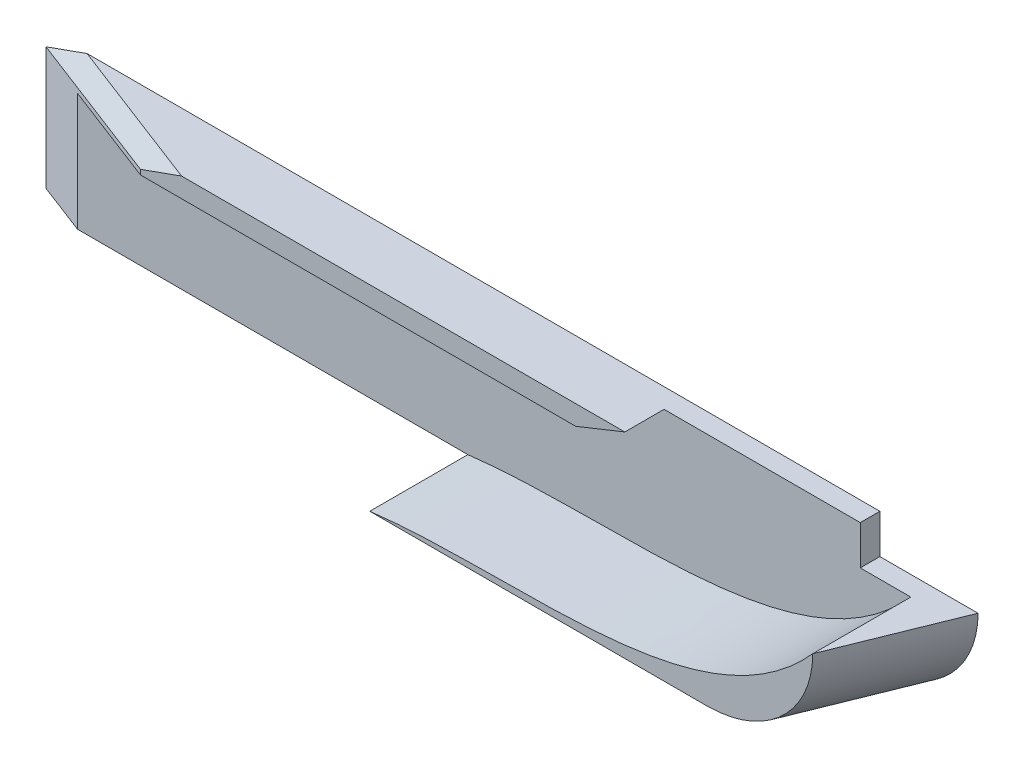
ISO-10303-21;
HEADER;
FILE_DESCRIPTION(('STEP AP214'),'2;1');
FILE_NAME('part.step','',(''),(''),'','','');
FILE_SCHEMA(('AUTOMOTIVE_DESIGN { 1 0 10303 214 1 1 1 1 }'));
ENDSEC;
DATA;
#1=APPLICATION_CONTEXT('core data for automotive mechanical design processes');
#2=APPLICATION_PROTOCOL_DEFINITION('international standard','automotive_design',2000,#1);
#3=PRODUCT_CONTEXT('',#1,'mechanical');
#4=PRODUCT('Part','Part','',(#3));
#5=PRODUCT_RELATED_PRODUCT_CATEGORY('part','',(#4));
#6=PRODUCT_DEFINITION_FORMATION('','',#4);
#7=PRODUCT_DEFINITION_CONTEXT('part definition',#1,'design');
#8=PRODUCT_DEFINITION('design','',#6,#7);
#9=PRODUCT_DEFINITION_SHAPE('','',#8);
#10=(LENGTH_UNIT() NAMED_UNIT(*) SI_UNIT(.MILLI.,.METRE.));
#11=(NAMED_UNIT(*) PLANE_ANGLE_UNIT() SI_UNIT($,.RADIAN.));
#12=(NAMED_UNIT(*) SI_UNIT($,.STERADIAN.) SOLID_ANGLE_UNIT());
#13=UNCERTAINTY_MEASURE_WITH_UNIT(LENGTH_MEASURE(1.E-05),#10,'distance_accuracy_value','');
#14=(GEOMETRIC_REPRESENTATION_CONTEXT(3) GLOBAL_UNCERTAINTY_ASSIGNED_CONTEXT((#13)) GLOBAL_UNIT_ASSIGNED_CONTEXT((#10,
#11,#12)) REPRESENTATION_CONTEXT('',''));
#15=CARTESIAN_POINT('',(0.,0.,0.));
#16=DIRECTION('',(0.,0.,1.));
#17=DIRECTION('',(1.,0.,0.));
#18=AXIS2_PLACEMENT_3D('',#15,#16,#17);
#19=CARTESIAN_POINT('',(32.9411764705883,11.906862745098,2.));
#20=DIRECTION('',(-1.,0.,0.));
#21=DIRECTION('',(0.,0.,1.));
#22=AXIS2_PLACEMENT_3D('',#19,#20,#21);
#23=PLANE('',#22);
#24=DIRECTION('',(0.,0.,-1.));
#25=VECTOR('',#24,1.);
#26=CARTESIAN_POINT('',(32.9411764705883,11.906862745098,2.));
#27=LINE('',#26,#25);
#28=CARTESIAN_POINT('',(32.9411764705883,11.906862745098,2.));
#29=VERTEX_POINT('',#28);
#30=CARTESIAN_POINT('',(32.9411764705883,11.906862745098,0.));
#31=VERTEX_POINT('',#30);
#32=EDGE_CURVE('E206',#29,#31,#27,.T.);
#33=ORIENTED_EDGE('',*,*,#32,.F.);
#34=DIRECTION('',(0.,1.,0.));
#35=VECTOR('',#34,1.);
#36=CARTESIAN_POINT('',(32.9411764705883,11.906862745098,2.));
#37=LINE('',#36,#35);
#38=CARTESIAN_POINT('',(32.9411764705883,7.90686274509804,2.));
#39=VERTEX_POINT('',#38);
#40=EDGE_CURVE('E203',#39,#29,#37,.T.);
#41=ORIENTED_EDGE('',*,*,#40,.F.);
#42=DIRECTION('',(0.,0.,-1.));
#43=VECTOR('',#42,1.);
#44=CARTESIAN_POINT('',(32.9411764705883,7.90686274509804,2.));
#45=LINE('',#44,#43);
#46=CARTESIAN_POINT('',(32.9411764705883,7.90686274509804,0.));
#47=VERTEX_POINT('',#46);
#48=EDGE_CURVE('E150',#39,#47,#45,.T.);
#49=ORIENTED_EDGE('',*,*,#48,.T.);
#50=DIRECTION('',(0.,1.,0.));
#51=VECTOR('',#50,1.);
#52=CARTESIAN_POINT('',(32.9411764705883,11.906862745098,0.));
#53=LINE('',#52,#51);
#54=EDGE_CURVE('E210',#47,#31,#53,.T.);
#55=ORIENTED_EDGE('',*,*,#54,.T.);
#56=EDGE_LOOP('',(#33,#41,#49,#55));
#57=FACE_BOUND('',#56,.T.);
#58=ADVANCED_FACE('F41',(#57),#23,.F.);
#59=CARTESIAN_POINT('',(0.,0.,2.));
#60=DIRECTION('',(0.,0.,1.));
#61=DIRECTION('',(1.,0.,0.));
#62=AXIS2_PLACEMENT_3D('',#59,#60,#61);
#63=PLANE('',#62);
#64=DIRECTION('',(-1.,0.,0.));
#65=VECTOR('',#64,1.);
#66=CARTESIAN_POINT('',(-7.05882352941175,7.90686274509804,2.));
#67=LINE('',#66,#65);
#68=CARTESIAN_POINT('',(38.0928617605663,7.90686274509804,2.));
#69=VERTEX_POINT('',#68);
#70=EDGE_CURVE('E138',#69,#39,#67,.T.);
#71=ORIENTED_EDGE('',*,*,#70,.T.);
#72=ORIENTED_EDGE('',*,*,#40,.T.);
#73=DIRECTION('',(-1.,0.,0.));
#74=VECTOR('',#73,1.);
#75=CARTESIAN_POINT('',(12.9411764705883,11.906862745098,2.));
#76=LINE('',#75,#74);
#77=CARTESIAN_POINT('',(12.9411764705883,11.906862745098,2.));
#78=VERTEX_POINT('',#77);
#79=EDGE_CURVE('E178',#29,#78,#76,.T.);
#80=ORIENTED_EDGE('',*,*,#79,.T.);
#81=DIRECTION('',(-0.928476690885259,-0.371390676354104,0.));
#82=VECTOR('',#81,1.);
#83=CARTESIAN_POINT('',(7.94117647058825,9.90686274509804,2.));
#84=LINE('',#83,#82);
#85=CARTESIAN_POINT('',(7.94117647058825,9.90686274509804,2.));
#86=VERTEX_POINT('',#85);
#87=EDGE_CURVE('E180',#78,#86,#84,.T.);
#88=ORIENTED_EDGE('',*,*,#87,.T.);
#89=DIRECTION('',(-1.,0.,0.));
#90=VECTOR('',#89,1.);
#91=CARTESIAN_POINT('',(0.,9.90686274509804,2.));
#92=LINE('',#91,#90);
#93=CARTESIAN_POINT('',(-46.848645400024,9.90686274509804,2.));
#94=VERTEX_POINT('',#93);
#95=EDGE_CURVE('E198',#86,#94,#92,.T.);
#96=ORIENTED_EDGE('',*,*,#95,.T.);
#97=DIRECTION('',(0.,1.,0.));
#98=VECTOR('',#97,1.);
#99=CARTESIAN_POINT('',(-46.848645400024,0.,2.));
#100=LINE('',#99,#98);
#101=CARTESIAN_POINT('',(-46.848645400024,-2.09313725490196,2.));
#102=VERTEX_POINT('',#101);
#103=EDGE_CURVE('E172',#102,#94,#100,.T.);
#104=ORIENTED_EDGE('',*,*,#103,.F.);
#105=DIRECTION('',(1.,0.,0.));
#106=VECTOR('',#105,1.);
#107=CARTESIAN_POINT('',(-52.0588235294118,-2.09313725490196,2.));
#108=LINE('',#107,#106);
#109=CARTESIAN_POINT('',(-7.05882352941175,-2.09313725490196,2.));
#110=VERTEX_POINT('',#109);
#111=EDGE_CURVE('E146',#102,#110,#108,.T.);
#112=ORIENTED_EDGE('',*,*,#111,.T.);
#113=CARTESIAN_POINT('',(-7.05882352941175,-2.09313725490196,2.));
#114=CARTESIAN_POINT('',(8.25389401731945,-0.195900435866995,2.));
#115=CARTESIAN_POINT('',(26.8793265828988,-4.67398742908621,2.));
#116=CARTESIAN_POINT('',(38.0928617605663,7.90686274509804,2.));
#117=B_SPLINE_CURVE_WITH_KNOTS('',3,(#113,#114,#115,#116),.UNSPECIFIED.,.F.,.F.,(4,4),(0.,1.),.UNSPECIFIED.);
#118=EDGE_CURVE('E130',#110,#69,#117,.T.);
#119=ORIENTED_EDGE('',*,*,#118,.T.);
#120=EDGE_LOOP('',(#71,#72,#80,#88,#96,#104,#112,#119));
#121=FACE_BOUND('',#120,.T.);
#122=ADVANCED_FACE('F142',(#121),#63,.T.);
#123=CARTESIAN_POINT('',(-52.0588235294118,-2.09313725490196,2.));
#124=DIRECTION('',(0.,1.,0.));
#125=DIRECTION('',(0.,0.,1.));
#126=AXIS2_PLACEMENT_3D('',#123,#124,#125);
#127=PLANE('',#126);
#128=DIRECTION('',(1.,0.,0.));
#129=VECTOR('',#128,1.);
#130=CARTESIAN_POINT('',(-52.0588235294118,-2.09313725490196,0.));
#131=LINE('',#130,#129);
#132=CARTESIAN_POINT('',(-52.0588235294118,-2.09313725490196,0.));
#133=VERTEX_POINT('',#132);
#134=CARTESIAN_POINT('',(32.1558290438124,-2.09313725490196,0.));
#135=VERTEX_POINT('',#134);
#136=EDGE_CURVE('E208',#133,#135,#131,.T.);
#137=ORIENTED_EDGE('',*,*,#136,.T.);
#138=DIRECTION('',(0.374606593415917,0.,-0.927183854566786));
#139=VECTOR('',#138,1.);
#140=CARTESIAN_POINT('',(19.643320070547,-2.09313725490196,30.9695464629822));
#141=LINE('',#140,#139);
#142=CARTESIAN_POINT('',(27.3075143337905,-2.09313725490196,12.));
#143=VERTEX_POINT('',#142);
#144=EDGE_CURVE('E49',#135,#143,#141,.F.);
#145=ORIENTED_EDGE('',*,*,#144,.T.);
#146=DIRECTION('',(1.,0.,0.));
#147=VECTOR('',#146,1.);
#148=CARTESIAN_POINT('',(-7.05882352941175,-2.09313725490196,12.));
#149=LINE('',#148,#147);
#150=CARTESIAN_POINT('',(-7.05882352941175,-2.09313725490196,12.));
#151=VERTEX_POINT('',#150);
#152=EDGE_CURVE('E167',#151,#143,#149,.T.);
#153=ORIENTED_EDGE('',*,*,#152,.F.);
#154=DIRECTION('',(0.,0.,-1.));
#155=VECTOR('',#154,1.);
#156=CARTESIAN_POINT('',(-7.05882352941175,-2.09313725490196,2.));
#157=LINE('',#156,#155);
#158=EDGE_CURVE('E165',#151,#110,#157,.T.);
#159=ORIENTED_EDGE('',*,*,#158,.T.);
#160=ORIENTED_EDGE('',*,*,#111,.F.);
#161=DIRECTION('',(-0.933580426497204,0.,-0.358367949545294));
#162=VECTOR('',#161,1.);
#163=CARTESIAN_POINT('',(-51.3896929230529,-2.09313725490196,0.256855174522597));
#164=LINE('',#163,#162);
#165=EDGE_CURVE('E174',#102,#133,#164,.T.);
#166=ORIENTED_EDGE('',*,*,#165,.T.);
#167=EDGE_LOOP('',(#137,#145,#153,#159,#160,#166));
#168=FACE_BOUND('',#167,.T.);
#169=ADVANCED_FACE('F255',(#168),#127,.F.);
#170=CARTESIAN_POINT('',(-52.0588235294118,11.906862745098,2.));
#171=DIRECTION('',(0.,-1.,0.));
#172=DIRECTION('',(0.,0.,-1.));
#173=AXIS2_PLACEMENT_3D('',#170,#171,#172);
#174=PLANE('',#173);
#175=DIRECTION('',(-1.,0.,0.));
#176=VECTOR('',#175,1.);
#177=CARTESIAN_POINT('',(-52.0588235294118,11.906862745098,0.));
#178=LINE('',#177,#176);
#179=CARTESIAN_POINT('',(-47.8731813649737,11.906862745098,0.));
#180=VERTEX_POINT('',#179);
#181=EDGE_CURVE('E204',#31,#180,#178,.T.);
#182=ORIENTED_EDGE('',*,*,#181,.T.);
#183=DIRECTION('',(0.933580426497204,0.,0.358367949545294));
#184=VECTOR('',#183,1.);
#185=CARTESIAN_POINT('',(-50.852140998735,11.906862745098,-1.14351546522322));
#186=LINE('',#185,#184);
#187=CARTESIAN_POINT('',(-32.2426469768105,11.906862745098,6.));
#188=VERTEX_POINT('',#187);
#189=EDGE_CURVE('E223',#180,#188,#186,.T.);
#190=ORIENTED_EDGE('',*,*,#189,.T.);
#191=DIRECTION('',(-1.,0.,0.));
#192=VECTOR('',#191,1.);
#193=CARTESIAN_POINT('',(-52.0588235294118,11.906862745098,6.));
#194=LINE('',#193,#192);
#195=CARTESIAN_POINT('',(12.9411764705882,11.906862745098,6.));
#196=VERTEX_POINT('',#195);
#197=EDGE_CURVE('E195',#196,#188,#194,.T.);
#198=ORIENTED_EDGE('',*,*,#197,.F.);
#199=DIRECTION('',(0.,0.,1.));
#200=VECTOR('',#199,1.);
#201=CARTESIAN_POINT('',(12.9411764705883,11.906862745098,2.));
#202=LINE('',#201,#200);
#203=EDGE_CURVE('E183',#78,#196,#202,.T.);
#204=ORIENTED_EDGE('',*,*,#203,.F.);
#205=ORIENTED_EDGE('',*,*,#79,.F.);
#206=ORIENTED_EDGE('',*,*,#32,.T.);
#207=EDGE_LOOP('',(#182,#190,#198,#204,#205,#206));
#208=FACE_BOUND('',#207,.T.);
#209=ADVANCED_FACE('F246',(#208),#174,.F.);
#210=CARTESIAN_POINT('',(0.,0.,0.));
#211=DIRECTION('',(0.,0.,1.));
#212=DIRECTION('',(1.,0.,0.));
#213=AXIS2_PLACEMENT_3D('',#210,#211,#212);
#214=PLANE('',#213);
#215=DIRECTION('',(1.,0.,0.));
#216=VECTOR('',#215,1.);
#217=CARTESIAN_POINT('',(32.9411764705883,7.90686274509804,0.));
#218=LINE('',#217,#216);
#219=CARTESIAN_POINT('',(42.9411764705883,7.90686274509803,0.));
#220=VERTEX_POINT('',#219);
#221=EDGE_CURVE('E189',#47,#220,#218,.T.);
#222=ORIENTED_EDGE('',*,*,#221,.T.);
#223=CARTESIAN_POINT('',(32.1558290438124,7.90686274509804,0.));
#224=DIRECTION('',(0.,0.,1.));
#225=DIRECTION('',(1.,0.,0.));
#226=AXIS2_PLACEMENT_3D('',#223,#224,#225);
#227=ELLIPSE('',#226,10.7853474267759,10.);
#228=EDGE_CURVE('E63',#220,#135,#227,.F.);
#229=ORIENTED_EDGE('',*,*,#228,.T.);
#230=ORIENTED_EDGE('',*,*,#136,.F.);
#231=DIRECTION('',(0.,-1.,0.));
#232=VECTOR('',#231,1.);
#233=CARTESIAN_POINT('',(-52.0588235294118,11.906862745098,0.));
#234=LINE('',#233,#232);
#235=CARTESIAN_POINT('',(-52.0588235294118,10.406862745098,0.));
#236=VERTEX_POINT('',#235);
#237=EDGE_CURVE('E201',#236,#133,#234,.T.);
#238=ORIENTED_EDGE('',*,*,#237,.F.);
#239=DIRECTION('',(-0.941376066179338,-0.337359010587703,0.));
#240=VECTOR('',#239,1.);
#241=CARTESIAN_POINT('',(-52.0588235294118,10.406862745098,0.));
#242=LINE('',#241,#240);
#243=EDGE_CURVE('E221',#236,#180,#242,.F.);
#244=ORIENTED_EDGE('',*,*,#243,.T.);
#245=ORIENTED_EDGE('',*,*,#181,.F.);
#246=ORIENTED_EDGE('',*,*,#54,.F.);
#247=EDGE_LOOP('',(#222,#229,#230,#238,#244,#245,#246));
#248=FACE_BOUND('',#247,.T.);
#249=ADVANCED_FACE('F243',(#248),#214,.F.);
#250=CARTESIAN_POINT('',(-52.0588235294118,9.90686274509804,6.));
#251=DIRECTION('',(0.,1.,0.));
#252=DIRECTION('',(0.,0.,1.));
#253=AXIS2_PLACEMENT_3D('',#250,#251,#252);
#254=PLANE('',#253);
#255=DIRECTION('',(1.,0.,0.));
#256=VECTOR('',#255,1.);
#257=CARTESIAN_POINT('',(-52.0588235294118,9.90686274509804,6.));
#258=LINE('',#257,#256);
#259=CARTESIAN_POINT('',(-36.4282891412486,9.90686274509804,6.));
#260=VERTEX_POINT('',#259);
#261=CARTESIAN_POINT('',(7.94117647058825,9.90686274509804,6.));
#262=VERTEX_POINT('',#261);
#263=EDGE_CURVE('E193',#260,#262,#258,.T.);
#264=ORIENTED_EDGE('',*,*,#263,.F.);
#265=DIRECTION('',(-0.933580426497204,0.,-0.358367949545294));
#266=VECTOR('',#265,1.);
#267=CARTESIAN_POINT('',(-50.0514317103352,9.90686274509804,0.770565523567791));
#268=LINE('',#267,#266);
#269=EDGE_CURVE('E169',#260,#94,#268,.T.);
#270=ORIENTED_EDGE('',*,*,#269,.T.);
#271=ORIENTED_EDGE('',*,*,#95,.F.);
#272=DIRECTION('',(0.,0.,1.));
#273=VECTOR('',#272,1.);
#274=CARTESIAN_POINT('',(7.94117647058825,9.90686274509804,2.));
#275=LINE('',#274,#273);
#276=EDGE_CURVE('E186',#86,#262,#275,.T.);
#277=ORIENTED_EDGE('',*,*,#276,.T.);
#278=EDGE_LOOP('',(#264,#270,#271,#277));
#279=FACE_BOUND('',#278,.T.);
#280=ADVANCED_FACE('F259',(#279),#254,.F.);
#281=CARTESIAN_POINT('',(0.,0.,6.));
#282=DIRECTION('',(0.,0.,-1.));
#283=DIRECTION('',(-1.,0.,0.));
#284=AXIS2_PLACEMENT_3D('',#281,#282,#283);
#285=PLANE('',#284);
#286=ORIENTED_EDGE('',*,*,#197,.T.);
#287=DIRECTION('',(0.941376066179338,0.337359010587703,0.));
#288=VECTOR('',#287,1.);
#289=CARTESIAN_POINT('',(-50.2798951854597,5.44289108912493,6.));
#290=LINE('',#289,#288);
#291=CARTESIAN_POINT('',(-36.4282891412486,10.406862745098,6.));
#292=VERTEX_POINT('',#291);
#293=EDGE_CURVE('E225',#188,#292,#290,.F.);
#294=ORIENTED_EDGE('',*,*,#293,.T.);
#295=DIRECTION('',(0.,-1.,0.));
#296=VECTOR('',#295,1.);
#297=CARTESIAN_POINT('',(-36.4282891412486,0.,6.));
#298=LINE('',#297,#296);
#299=EDGE_CURVE('E216',#292,#260,#298,.T.);
#300=ORIENTED_EDGE('',*,*,#299,.T.);
#301=ORIENTED_EDGE('',*,*,#263,.T.);
#302=DIRECTION('',(-0.928476690885259,-0.371390676354104,0.));
#303=VECTOR('',#302,1.);
#304=CARTESIAN_POINT('',(7.94117647058825,9.90686274509804,6.));
#305=LINE('',#304,#303);
#306=EDGE_CURVE('E177',#196,#262,#305,.T.);
#307=ORIENTED_EDGE('',*,*,#306,.F.);
#308=EDGE_LOOP('',(#286,#294,#300,#301,#307));
#309=FACE_BOUND('',#308,.T.);
#310=ADVANCED_FACE('F230',(#309),#285,.F.);
#311=CARTESIAN_POINT('',(32.9411764705883,7.90686274509804,2.));
#312=DIRECTION('',(0.,1.,0.));
#313=DIRECTION('',(-1.,0.,0.));
#314=AXIS2_PLACEMENT_3D('',#311,#312,#313);
#315=PLANE('',#314);
#316=DIRECTION('',(0.,0.,1.));
#317=VECTOR('',#316,1.);
#318=CARTESIAN_POINT('',(38.0928617605663,7.90686274509804,2.));
#319=LINE('',#318,#317);
#320=CARTESIAN_POINT('',(38.0928617605663,7.90686274509804,12.));
#321=VERTEX_POINT('',#320);
#322=EDGE_CURVE('E127',#69,#321,#319,.T.);
#323=ORIENTED_EDGE('',*,*,#322,.T.);
#324=DIRECTION('',(-0.374606593415917,0.,0.927183854566786));
#325=VECTOR('',#324,1.);
#326=CARTESIAN_POINT('',(40.8432171018225,7.90686274509804,5.19263165263367));
#327=LINE('',#326,#325);
#328=EDGE_CURVE('E137',#220,#321,#327,.T.);
#329=ORIENTED_EDGE('',*,*,#328,.F.);
#330=ORIENTED_EDGE('',*,*,#221,.F.);
#331=ORIENTED_EDGE('',*,*,#48,.F.);
#332=ORIENTED_EDGE('',*,*,#70,.F.);
#333=EDGE_LOOP('',(#323,#329,#330,#331,#332));
#334=FACE_BOUND('',#333,.T.);
#335=ADVANCED_FACE('F148',(#334),#315,.T.);
#336=CARTESIAN_POINT('',(7.94117647058825,9.90686274509804,2.));
#337=DIRECTION('',(-0.371390676354104,0.928476690885259,0.));
#338=DIRECTION('',(-0.928476690885259,-0.371390676354104,0.));
#339=AXIS2_PLACEMENT_3D('',#336,#337,#338);
#340=PLANE('',#339);
#341=ORIENTED_EDGE('',*,*,#306,.T.);
#342=ORIENTED_EDGE('',*,*,#276,.F.);
#343=ORIENTED_EDGE('',*,*,#87,.F.);
#344=ORIENTED_EDGE('',*,*,#203,.T.);
#345=EDGE_LOOP('',(#341,#342,#343,#344));
#346=FACE_BOUND('',#345,.T.);
#347=ADVANCED_FACE('F261',(#346),#340,.F.);
#348=CARTESIAN_POINT('',(-52.0588235294118,-8.09313725490196,0.));
#349=DIRECTION('',(0.358367949545294,0.,-0.933580426497204));
#350=DIRECTION('',(-0.933580426497204,0.,-0.358367949545294));
#351=AXIS2_PLACEMENT_3D('',#348,#349,#350);
#352=PLANE('',#351);
#353=ORIENTED_EDGE('',*,*,#299,.F.);
#354=DIRECTION('',(-0.933580426497204,0.,-0.358367949545294));
#355=VECTOR('',#354,1.);
#356=CARTESIAN_POINT('',(-52.0588235294118,10.406862745098,0.));
#357=LINE('',#356,#355);
#358=EDGE_CURVE('E218',#292,#236,#357,.T.);
#359=ORIENTED_EDGE('',*,*,#358,.T.);
#360=ORIENTED_EDGE('',*,*,#237,.T.);
#361=ORIENTED_EDGE('',*,*,#165,.F.);
#362=ORIENTED_EDGE('',*,*,#103,.T.);
#363=ORIENTED_EDGE('',*,*,#269,.F.);
#364=EDGE_LOOP('',(#353,#359,#360,#361,#362,#363));
#365=FACE_BOUND('',#364,.T.);
#366=ADVANCED_FACE('F238',(#365),#352,.F.);
#367=CARTESIAN_POINT('',(-52.0588235294118,10.406862745098,0.));
#368=DIRECTION('',(0.253404407283395,-0.707106781186549,-0.660141050359201));
#369=DIRECTION('',(-0.933580426497204,0.,-0.358367949545294));
#370=AXIS2_PLACEMENT_3D('',#367,#368,#369);
#371=PLANE('',#370);
#372=ORIENTED_EDGE('',*,*,#293,.F.);
#373=ORIENTED_EDGE('',*,*,#189,.F.);
#374=ORIENTED_EDGE('',*,*,#243,.F.);
#375=ORIENTED_EDGE('',*,*,#358,.F.);
#376=EDGE_LOOP('',(#372,#373,#374,#375));
#377=FACE_BOUND('',#376,.T.);
#378=ADVANCED_FACE('F241',(#377),#371,.F.);
#379=CARTESIAN_POINT('',(-7.05882352941175,-2.09313725490196,12.));
#380=DIRECTION('',(0.,0.,1.));
#381=DIRECTION('',(1.,0.,0.));
#382=AXIS2_PLACEMENT_3D('',#379,#380,#381);
#383=PLANE('',#382);
#384=CARTESIAN_POINT('',(-7.05882352941175,-2.09313725490196,12.));
#385=CARTESIAN_POINT('',(8.25389401731945,-0.195900435866995,12.));
#386=CARTESIAN_POINT('',(26.8793265828988,-4.67398742908621,12.));
#387=CARTESIAN_POINT('',(38.0928617605663,7.90686274509804,12.));
#388=B_SPLINE_CURVE_WITH_KNOTS('',3,(#384,#385,#386,#387),.UNSPECIFIED.,.F.,.F.,(4,4),(0.,1.),.UNSPECIFIED.);
#389=EDGE_CURVE('E133',#151,#321,#388,.T.);
#390=ORIENTED_EDGE('',*,*,#389,.F.);
#391=ORIENTED_EDGE('',*,*,#152,.T.);
#392=CARTESIAN_POINT('',(27.3075143337904,7.90686274509804,12.));
#393=DIRECTION('',(0.,0.,1.));
#394=DIRECTION('',(1.,0.,0.));
#395=AXIS2_PLACEMENT_3D('',#392,#393,#394);
#396=ELLIPSE('',#395,10.7853474267759,10.);
#397=EDGE_CURVE('E11',#143,#321,#396,.T.);
#398=ORIENTED_EDGE('',*,*,#397,.T.);
#399=EDGE_LOOP('',(#390,#391,#398));
#400=FACE_BOUND('',#399,.T.);
#401=ADVANCED_FACE('F254',(#400),#383,.T.);
#402=CARTESIAN_POINT('',(33.6693379249204,7.90686274509804,-3.74606593415917));
#403=DIRECTION('',(0.374606593415917,0.,-0.927183854566786));
#404=DIRECTION('',(-0.927183854566786,0.,-0.374606593415917));
#405=AXIS2_PLACEMENT_3D('',#402,#403,#404);
#406=CYLINDRICAL_SURFACE('',#405,10.);
#407=ORIENTED_EDGE('',*,*,#397,.F.);
#408=ORIENTED_EDGE('',*,*,#144,.F.);
#409=ORIENTED_EDGE('',*,*,#228,.F.);
#410=ORIENTED_EDGE('',*,*,#328,.T.);
#411=EDGE_LOOP('',(#407,#408,#409,#410));
#412=FACE_BOUND('',#411,.T.);
#413=ADVANCED_FACE('F43',(#412),#406,.T.);
#414=DIRECTION('',(0.,0.,1.));
#415=VECTOR('',#414,1.);
#416=SURFACE_OF_LINEAR_EXTRUSION('',#117,#415);
#417=ORIENTED_EDGE('',*,*,#389,.T.);
#418=ORIENTED_EDGE('',*,*,#322,.F.);
#419=ORIENTED_EDGE('',*,*,#118,.F.);
#420=ORIENTED_EDGE('',*,*,#158,.F.);
#421=EDGE_LOOP('',(#417,#418,#419,#420));
#422=FACE_BOUND('',#421,.T.);
#423=ADVANCED_FACE('F129',(#422),#416,.F.);
#424=CLOSED_SHELL('',(#58,#122,#169,#209,#249,#280,#310,#335,#347,#366,#378,#401,#413,#423));
#425=MANIFOLD_SOLID_BREP('B2',#424);
#426=ADVANCED_BREP_SHAPE_REPRESENTATION('',(#18,#425),#14);
#427=SHAPE_DEFINITION_REPRESENTATION(#9,#426);
ENDSEC;
END-ISO-10303-21;
